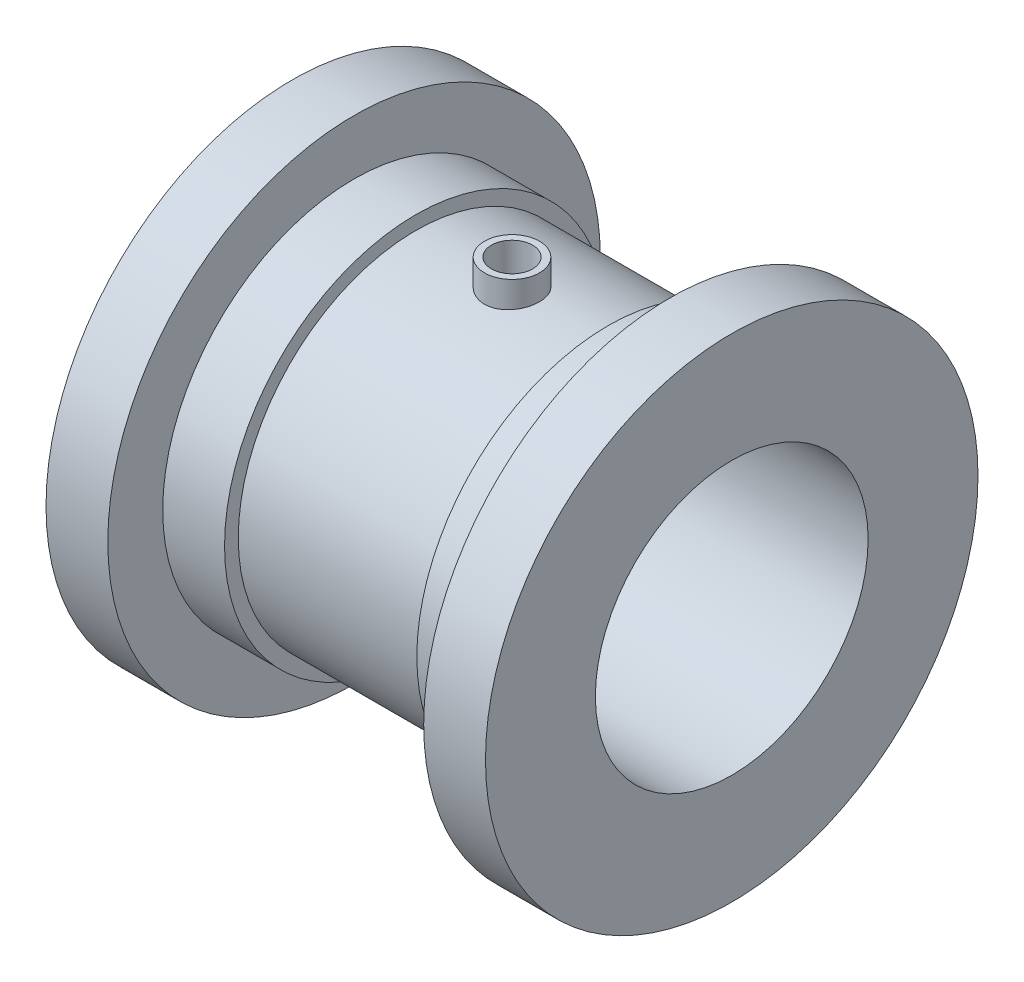
ISO-10303-21;
HEADER;
FILE_DESCRIPTION(('STEP AP214'),'2;1');
FILE_NAME('part.step','',(''),(''),'','','');
FILE_SCHEMA(('AUTOMOTIVE_DESIGN { 1 0 10303 214 1 1 1 1 }'));
ENDSEC;
DATA;
#1=APPLICATION_CONTEXT('core data for automotive mechanical design processes');
#2=APPLICATION_PROTOCOL_DEFINITION('international standard','automotive_design',2000,#1);
#3=PRODUCT_CONTEXT('',#1,'mechanical');
#4=PRODUCT('Part','Part','',(#3));
#5=PRODUCT_RELATED_PRODUCT_CATEGORY('part','',(#4));
#6=PRODUCT_DEFINITION_FORMATION('','',#4);
#7=PRODUCT_DEFINITION_CONTEXT('part definition',#1,'design');
#8=PRODUCT_DEFINITION('design','',#6,#7);
#9=PRODUCT_DEFINITION_SHAPE('','',#8);
#10=(LENGTH_UNIT() NAMED_UNIT(*) SI_UNIT(.MILLI.,.METRE.));
#11=(NAMED_UNIT(*) PLANE_ANGLE_UNIT() SI_UNIT($,.RADIAN.));
#12=(NAMED_UNIT(*) SI_UNIT($,.STERADIAN.) SOLID_ANGLE_UNIT());
#13=UNCERTAINTY_MEASURE_WITH_UNIT(LENGTH_MEASURE(1.E-05),#10,'distance_accuracy_value','');
#14=(GEOMETRIC_REPRESENTATION_CONTEXT(3) GLOBAL_UNCERTAINTY_ASSIGNED_CONTEXT((#13)) GLOBAL_UNIT_ASSIGNED_CONTEXT((#10,
#11,#12)) REPRESENTATION_CONTEXT('',''));
#15=CARTESIAN_POINT('',(0.,0.,0.));
#16=DIRECTION('',(0.,0.,1.));
#17=DIRECTION('',(1.,0.,0.));
#18=AXIS2_PLACEMENT_3D('',#15,#16,#17);
#19=CARTESIAN_POINT('',(-45.635800037677,0.49240465140176,0.));
#20=DIRECTION('',(-1.,0.,0.));
#21=DIRECTION('',(0.,0.,1.));
#22=AXIS2_PLACEMENT_3D('',#19,#20,#21);
#23=CYLINDRICAL_SURFACE('',#22,35.8603209398709);
#24=CARTESIAN_POINT('',(-32.,0.49240465140176,0.));
#25=DIRECTION('',(-1.,0.,0.));
#26=DIRECTION('',(0.,0.,1.));
#27=AXIS2_PLACEMENT_3D('',#24,#25,#26);
#28=CIRCLE('',#27,35.8603209398709);
#29=CARTESIAN_POINT('',(-32.,0.49240465140176,35.8603209398709));
#30=VERTEX_POINT('',#29);
#31=EDGE_CURVE('E93',#30,#30,#28,.T.);
#32=ORIENTED_EDGE('',*,*,#31,.F.);
#33=EDGE_LOOP('',(#32));
#34=FACE_BOUND('',#33,.T.);
#35=CARTESIAN_POINT('',(-23.,0.49240465140176,0.));
#36=DIRECTION('',(-1.,0.,0.));
#37=DIRECTION('',(0.,0.,1.));
#38=AXIS2_PLACEMENT_3D('',#35,#36,#37);
#39=CIRCLE('',#38,35.8603209398709);
#40=CARTESIAN_POINT('',(-23.,0.49240465140176,35.8603209398709));
#41=VERTEX_POINT('',#40);
#42=EDGE_CURVE('E11',#41,#41,#39,.T.);
#43=ORIENTED_EDGE('',*,*,#42,.T.);
#44=EDGE_LOOP('',(#43));
#45=FACE_BOUND('',#44,.T.);
#46=ADVANCED_FACE('F41',(#34,#45),#23,.T.);
#47=CARTESIAN_POINT('',(-23.,36.3527255912726,0.));
#48=DIRECTION('',(-1.,0.,0.));
#49=DIRECTION('',(0.,0.,1.));
#50=AXIS2_PLACEMENT_3D('',#47,#48,#49);
#51=PLANE('',#50);
#52=ORIENTED_EDGE('',*,*,#42,.F.);
#53=EDGE_LOOP('',(#52));
#54=FACE_BOUND('',#53,.T.);
#55=CARTESIAN_POINT('',(-23.,0.49240465140176,0.));
#56=DIRECTION('',(-1.,0.,0.));
#57=DIRECTION('',(0.,0.,1.));
#58=AXIS2_PLACEMENT_3D('',#55,#56,#57);
#59=CIRCLE('',#58,27.8603209398709);
#60=CARTESIAN_POINT('',(-23.,0.49240465140176,27.8603209398709));
#61=VERTEX_POINT('',#60);
#62=EDGE_CURVE('E53',#61,#61,#59,.T.);
#63=ORIENTED_EDGE('',*,*,#62,.T.);
#64=EDGE_LOOP('',(#63));
#65=FACE_BOUND('',#64,.T.);
#66=ADVANCED_FACE('F113',(#54,#65),#51,.F.);
#67=CARTESIAN_POINT('',(-45.635800037677,0.49240465140176,0.));
#68=DIRECTION('',(-1.,0.,0.));
#69=DIRECTION('',(0.,0.,1.));
#70=AXIS2_PLACEMENT_3D('',#67,#68,#69);
#71=CYLINDRICAL_SURFACE('',#70,27.8603209398709);
#72=ORIENTED_EDGE('',*,*,#62,.F.);
#73=EDGE_LOOP('',(#72));
#74=FACE_BOUND('',#73,.T.);
#75=CARTESIAN_POINT('',(-14.,0.49240465140176,0.));
#76=DIRECTION('',(-1.,0.,0.));
#77=DIRECTION('',(0.,0.,1.));
#78=AXIS2_PLACEMENT_3D('',#75,#76,#77);
#79=CIRCLE('',#78,27.8603209398709);
#80=CARTESIAN_POINT('',(-14.,0.49240465140176,27.8603209398709));
#81=VERTEX_POINT('',#80);
#82=EDGE_CURVE('E58',#81,#81,#79,.T.);
#83=ORIENTED_EDGE('',*,*,#82,.T.);
#84=EDGE_LOOP('',(#83));
#85=FACE_BOUND('',#84,.T.);
#86=ADVANCED_FACE('F110',(#74,#85),#71,.T.);
#87=CARTESIAN_POINT('',(-14.,28.3527255912726,0.));
#88=DIRECTION('',(-1.,0.,0.));
#89=DIRECTION('',(0.,0.,1.));
#90=AXIS2_PLACEMENT_3D('',#87,#88,#89);
#91=PLANE('',#90);
#92=ORIENTED_EDGE('',*,*,#82,.F.);
#93=EDGE_LOOP('',(#92));
#94=FACE_BOUND('',#93,.T.);
#95=CARTESIAN_POINT('',(-14.,0.49240465140176,0.));
#96=DIRECTION('',(-1.,0.,0.));
#97=DIRECTION('',(0.,0.,1.));
#98=AXIS2_PLACEMENT_3D('',#95,#96,#97);
#99=CIRCLE('',#98,25.8603209398709);
#100=CARTESIAN_POINT('',(-14.,0.49240465140176,25.8603209398709));
#101=VERTEX_POINT('',#100);
#102=EDGE_CURVE('E126',#101,#101,#99,.T.);
#103=ORIENTED_EDGE('',*,*,#102,.T.);
#104=EDGE_LOOP('',(#103));
#105=FACE_BOUND('',#104,.T.);
#106=ADVANCED_FACE('F105',(#94,#105),#91,.F.);
#107=CARTESIAN_POINT('',(-45.635800037677,0.49240465140176,0.));
#108=DIRECTION('',(-1.,0.,0.));
#109=DIRECTION('',(0.,0.,1.));
#110=AXIS2_PLACEMENT_3D('',#107,#108,#109);
#111=CYLINDRICAL_SURFACE('',#110,25.8603209398709);
#112=CARTESIAN_POINT('',(0.,26.041498551443,4.));
#113=CARTESIAN_POINT('',(0.223235078696461,26.0415023715428,3.99999084326046));
#114=CARTESIAN_POINT('',(0.446597670654171,26.0444559962012,3.98124906814162));
#115=CARTESIAN_POINT('',(0.887071885793124,26.0559426184085,3.90680047870448));
#116=CARTESIAN_POINT('',(1.10417729232606,26.0644809776663,3.85105814067276));
#117=CARTESIAN_POINT('',(1.52569792990848,26.086147385703,3.70432115944753));
#118=CARTESIAN_POINT('',(1.7301229877367,26.09927182677,3.61335422016288));
#119=CARTESIAN_POINT('',(2.12078094974435,26.1286273283384,3.3988165465793));
#120=CARTESIAN_POINT('',(2.30701622995979,26.1448579822693,3.27525007841262));
#121=CARTESIAN_POINT('',(2.65761919887285,26.1787514511707,2.99789888182619));
#122=CARTESIAN_POINT('',(2.821809729735,26.1964242230253,2.84389139411188));
#123=CARTESIAN_POINT('',(3.1221262532405,26.2311218989636,2.51051100304322));
#124=CARTESIAN_POINT('',(3.25825067094325,26.2481467666462,2.33113667717079));
#125=CARTESIAN_POINT('',(3.499227687357,26.2797349060224,1.95097582689146));
#126=CARTESIAN_POINT('',(3.60391666212749,26.2942851325822,1.75008440789343));
#127=CARTESIAN_POINT('',(3.77800057426712,26.3191741482448,1.33330624459607));
#128=CARTESIAN_POINT('',(3.84739749225448,26.329513173677,1.11742034257206));
#129=CARTESIAN_POINT('',(3.9483889869917,26.3447446024268,0.678607613865191));
#130=CARTESIAN_POINT('',(3.98028051717067,26.3496797696504,0.455750638592846));
#131=CARTESIAN_POINT('',(4.00627837606847,26.3536940860209,0.00779768197377162));
#132=CARTESIAN_POINT('',(4.00038693189221,26.3527735803285,-0.217298166622402));
#133=CARTESIAN_POINT('',(3.95121967593788,26.3452143497849,-0.661312053638072));
#134=CARTESIAN_POINT('',(3.90826336749048,26.3386244967729,-0.880266422196354));
#135=CARTESIAN_POINT('',(3.78668770168433,26.3205214579585,-1.30782133729719));
#136=CARTESIAN_POINT('',(3.70806737967128,26.3090081389848,-1.51642160360858));
#137=CARTESIAN_POINT('',(3.5170709356684,26.2822680097395,-1.91830940992599));
#138=CARTESIAN_POINT('',(3.40456108192839,26.2670265333806,-2.1115323786077));
#139=CARTESIAN_POINT('',(3.1490770432953,26.2345273206054,-2.47647670209884));
#140=CARTESIAN_POINT('',(3.00610072818882,26.2172694432405,-2.64819655207772));
#141=CARTESIAN_POINT('',(2.69196454706266,26.1824476480985,-2.96714470703453));
#142=CARTESIAN_POINT('',(2.52052564328325,26.1648824170914,-3.11409817486465));
#143=CARTESIAN_POINT('',(2.15527670808161,26.1316012310287,-3.37719386686125));
#144=CARTESIAN_POINT('',(1.96146652183675,26.1158852887728,-3.49333587777569));
#145=CARTESIAN_POINT('',(1.55668139874425,26.088082161248,-3.6915534907609));
#146=CARTESIAN_POINT('',(1.34569175841384,26.0759981268275,-3.7735995364777));
#147=CARTESIAN_POINT('',(0.912698248703498,26.0568817355788,-3.90101280403022));
#148=CARTESIAN_POINT('',(0.690695208720324,26.0498489989631,-3.94638278342901));
#149=CARTESIAN_POINT('',(0.244425745626258,26.0417039111849,-3.99877638189308));
#150=CARTESIAN_POINT('',(0.0202061941221937,26.0405313206997,-4.00619019050783));
#151=CARTESIAN_POINT('',(-0.426272447683629,26.0440792182801,-3.98349755044328));
#152=CARTESIAN_POINT('',(-0.648531602568696,26.0487995114748,-3.95339234247497));
#153=CARTESIAN_POINT('',(-1.08356323902636,26.06354589513,-3.85684765553785));
#154=CARTESIAN_POINT('',(-1.29638016758638,26.0735434230924,-3.79060370976712));
#155=CARTESIAN_POINT('',(-1.70789039216207,26.0976941405928,-3.623865819776));
#156=CARTESIAN_POINT('',(-1.90658294961586,26.1118475472432,-3.52337008612298));
#157=CARTESIAN_POINT('',(-2.28594999929625,26.1428566831115,-3.29004833782971));
#158=CARTESIAN_POINT('',(-2.46646784780051,26.1597330997277,-3.15697042739943));
#159=CARTESIAN_POINT('',(-2.8027484878409,26.1942248943289,-2.86261088768299));
#160=CARTESIAN_POINT('',(-2.95850978681409,26.2118403167874,-2.7013275591332));
#161=CARTESIAN_POINT('',(-3.24226349312508,26.2460141962602,-2.35341423203775));
#162=CARTESIAN_POINT('',(-3.36999687120947,26.2625618712333,-2.16657175587908));
#163=CARTESIAN_POINT('',(-3.59226155896465,26.2925667918355,-1.77385430633165));
#164=CARTESIAN_POINT('',(-3.68679382324598,26.3060241263154,-1.56797988037149));
#165=CARTESIAN_POINT('',(-3.83956188800598,26.3282849507809,-1.14384063461669));
#166=CARTESIAN_POINT('',(-3.89793766628388,26.3371063680912,-0.925627213381367));
#167=CARTESIAN_POINT('',(-3.97718810792214,26.3491768249089,-0.482347943198597));
#168=CARTESIAN_POINT('',(-3.99806541196336,26.3524262568005,-0.257282577907266));
#169=CARTESIAN_POINT('',(-4.00165869979233,26.3529822517439,0.190802835524679));
#170=CARTESIAN_POINT('',(-3.98477041146674,26.3503504417613,0.413819734263655));
#171=CARTESIAN_POINT('',(-3.91416222111441,26.3395643457862,0.853801370782615));
#172=CARTESIAN_POINT('',(-3.86044245936849,26.3314100808271,1.07076613161023));
#173=CARTESIAN_POINT('',(-3.71783977845517,26.3104912623486,1.49236444435116));
#174=CARTESIAN_POINT('',(-3.6289859629113,26.2977305254034,1.69700804135429));
#175=CARTESIAN_POINT('',(-3.4186800811105,26.2689980238011,2.08854387777262));
#176=CARTESIAN_POINT('',(-3.29722682261554,26.2530261417104,2.27543546761681));
#177=CARTESIAN_POINT('',(-3.02374624371408,26.2194466946816,2.62816569529418));
#178=CARTESIAN_POINT('',(-2.87142735869956,26.2018244651251,2.79377690159537));
#179=CARTESIAN_POINT('',(-2.54115265071612,26.1670370216216,3.09723130092927));
#180=CARTESIAN_POINT('',(-2.36319082480621,26.1498719158039,3.23506797384937));
#181=CARTESIAN_POINT('',(-1.98542188192016,26.1178314947969,3.47980875645661));
#182=CARTESIAN_POINT('',(-1.78549003923046,26.102970543968,3.5865222084603));
#183=CARTESIAN_POINT('',(-1.37040087050697,26.0773897722471,3.76469216256432));
#184=CARTESIAN_POINT('',(-1.15525944746334,26.0666656994874,3.83618488545737));
#185=CARTESIAN_POINT('',(-0.782654569801745,26.0530238493501,3.92584666853802));
#186=CARTESIAN_POINT('',(-0.627480779408552,26.048725076571,3.95361106824486));
#187=CARTESIAN_POINT('',(-0.314892456547065,26.0429611004124,3.99069083212244));
#188=CARTESIAN_POINT('',(-0.157477956077747,26.0414958566089,4.00000645948941));
#189=CARTESIAN_POINT('',(0.,26.041498551443,4.));
#190=B_SPLINE_CURVE_WITH_KNOTS('',3,(#112,#113,#114,#115,#116,#117,#118,#119,#120,#121,#122,
#123,#124,#125,#126,#127,#128,#129,#130,#131,#132,#133,#134,#135,#136,#137,#138,#139,#140,#141,
#142,#143,#144,#145,#146,#147,#148,#149,#150,#151,#152,#153,#154,#155,#156,#157,#158,#159,#160,
#161,#162,#163,#164,#165,#166,#167,#168,#169,#170,#171,#172,#173,#174,#175,#176,#177,#178,#179,
#180,#181,#182,#183,#184,#185,#186,#187,#188,#189),.UNSPECIFIED.,.T.,.F.,(4,2,2,2,2,2,2,2,2,2,2,
2,2,2,2,2,2,2,2,2,2,2,2,2,2,2,2,2,2,2,2,2,2,2,2,2,2,2,4),(0.,0.669129565415921,1.33890248359209,
2.00814969637032,2.67730937162208,3.35156027351045,4.025849000953,4.70358892673837,
5.3812908130228,6.0535899946383,6.72584954816515,7.3923713918024,8.05891126486052,
8.72811662287007,9.39736878704592,10.0736181698907,10.7498722330661,11.4267112956721,
12.1034994640511,12.773316075001,13.4431105364689,14.1093164235985,14.7755571209792,
15.4471209189554,16.1187251899115,16.7962968045155,17.4738489357383,18.1487612921506,
18.8236261186816,19.4914525263168,20.1592763904014,20.8265482113383,21.4938444392954,
22.1677654985275,22.841844577884,23.5199702040694,24.1973969864152,24.6694314903495,
25.141459260036),.UNSPECIFIED.);
#191=CARTESIAN_POINT('',(0.,26.041498551443,4.));
#192=VERTEX_POINT('',#191);
#193=EDGE_CURVE('E66',#192,#192,#190,.T.);
#194=ORIENTED_EDGE('',*,*,#193,.F.);
#195=EDGE_LOOP('',(#194));
#196=FACE_BOUND('',#195,.T.);
#197=CARTESIAN_POINT('',(0.,-25.1933150993299,3.));
#198=CARTESIAN_POINT('',(0.167901892163172,-25.1933173560347,2.99999280642211));
#199=CARTESIAN_POINT('',(0.335911068326354,-25.1949791680281,2.98585694864572));
#200=CARTESIAN_POINT('',(0.667260489203529,-25.2014449657636,2.929685876814));
#201=CARTESIAN_POINT('',(0.830595558283836,-25.2062523039407,2.88762089578641));
#202=CARTESIAN_POINT('',(1.1477509928841,-25.2184574683041,2.77684244584519));
#203=CARTESIAN_POINT('',(1.30157747497407,-25.2258536083568,2.7081463191542));
#204=CARTESIAN_POINT('',(1.59548769603269,-25.2424009730624,2.54609134141144));
#205=CARTESIAN_POINT('',(1.73557392388027,-25.2515518789702,2.45273696825498));
#206=CARTESIAN_POINT('',(1.99873566985179,-25.2706273150589,2.24353095078096));
#207=CARTESIAN_POINT('',(2.1217351256299,-25.28055501506,2.1275839060216));
#208=CARTESIAN_POINT('',(2.34657554090634,-25.3000368410948,1.87668878542464));
#209=CARTESIAN_POINT('',(2.4484154809691,-25.3095909491113,1.74173979462537));
#210=CARTESIAN_POINT('',(2.62831554343576,-25.3272811824825,1.45619740359608));
#211=CARTESIAN_POINT('',(2.70630733323965,-25.3354132051262,1.30556067603095));
#212=CARTESIAN_POINT('',(2.83585973912194,-25.349308284578,0.993218161130457));
#213=CARTESIAN_POINT('',(2.8874212061018,-25.3550714176494,0.831512730332477));
#214=CARTESIAN_POINT('',(2.96242345523757,-25.36355706764,0.502398069839474));
#215=CARTESIAN_POINT('',(2.98599022482494,-25.3662932034155,0.335017908273429));
#216=CARTESIAN_POINT('',(3.00472431931191,-25.3684630101531,-0.00134254090072416));
#217=CARTESIAN_POINT('',(2.99989261504699,-25.3678967940101,-0.170322773611331));
#218=CARTESIAN_POINT('',(2.96206838156144,-25.3635367605275,-0.504230198759423));
#219=CARTESIAN_POINT('',(2.92921133857713,-25.3597584719814,-0.669172969966987));
#220=CARTESIAN_POINT('',(2.83648063354103,-25.3494164049408,-0.991187256821801));
#221=CARTESIAN_POINT('',(2.77660651902458,-25.342852579796,-1.14825864059513));
#222=CARTESIAN_POINT('',(2.63139548026032,-25.3276503530783,-1.45049385490445));
#223=CARTESIAN_POINT('',(2.54599941562206,-25.3190071422495,-1.59562901930468));
#224=CARTESIAN_POINT('',(2.35221154417119,-25.3006142472112,-1.86955919976054));
#225=CARTESIAN_POINT('',(2.24381882875765,-25.2908645192901,-1.99835356986767));
#226=CARTESIAN_POINT('',(2.00635446711445,-25.2712831143704,-2.23674122419171));
#227=CARTESIAN_POINT('',(1.87716482406937,-25.2614512928595,-2.3462169904106));
#228=CARTESIAN_POINT('',(1.60218061085515,-25.2428706956386,-2.5419478333726));
#229=CARTESIAN_POINT('',(1.45638600078395,-25.2341219225312,-2.62820285431415));
#230=CARTESIAN_POINT('',(1.15223126740478,-25.2186978075187,-2.77504764425012));
#231=CARTESIAN_POINT('',(0.993866963078515,-25.2120231591824,-2.83562883060054));
#232=CARTESIAN_POINT('',(0.669118852653958,-25.2015169115406,-2.92930639686701));
#233=CARTESIAN_POINT('',(0.502735378140214,-25.1976851947898,-2.96240391217513));
#234=CARTESIAN_POINT('',(0.167707451140603,-25.1933197443238,-3.00002070951527));
#235=CARTESIAN_POINT('',(-0.000918235956218547,-25.1927669688599,-3.00470499885878));
#236=CARTESIAN_POINT('',(-0.336552010842732,-25.1949716764043,-2.98579696947045));
#237=CARTESIAN_POINT('',(-0.503560128166951,-25.1977290988578,-2.96220516800473));
#238=CARTESIAN_POINT('',(-0.830728745052976,-25.206226159645,-2.88755323941688));
#239=CARTESIAN_POINT('',(-0.990907553100186,-25.2119572002923,-2.83657228816018));
#240=CARTESIAN_POINT('',(-1.30044201187721,-25.2257487924018,-2.70867046317289));
#241=CARTESIAN_POINT('',(-1.44979733250076,-25.2338094148767,-2.63174879867893));
#242=CARTESIAN_POINT('',(-1.73419386077641,-25.2513977548111,-2.45374042705698));
#243=CARTESIAN_POINT('',(-1.8691666553332,-25.260931997735,-2.35254507427021));
#244=CARTESIAN_POINT('',(-2.12027036162512,-25.2803725077155,-2.12901629291433));
#245=CARTESIAN_POINT('',(-2.23640064348234,-25.290278787195,-2.00668215798852));
#246=CARTESIAN_POINT('',(-2.44709837136283,-25.3094053058216,-1.7436295137138));
#247=CARTESIAN_POINT('',(-2.54155769034848,-25.3186219565297,-1.60282409982068));
#248=CARTESIAN_POINT('',(-2.70548556300875,-25.3352776649366,-1.30725100186564));
#249=CARTESIAN_POINT('',(-2.77495455972282,-25.3427167541479,-1.15248356538946));
#250=CARTESIAN_POINT('',(-2.88674946354459,-25.354963134057,-0.833745957081878));
#251=CARTESIAN_POINT('',(-2.92913894025521,-25.3597765845691,-0.669798328222981));
#252=CARTESIAN_POINT('',(-2.98577859440298,-25.3662548125884,-0.33705347734763));
#253=CARTESIAN_POINT('',(-3.00002985612628,-25.3679197114228,-0.168256442453907));
#254=CARTESIAN_POINT('',(-2.99997022366016,-25.3679128745331,0.168337546177355));
#255=CARTESIAN_POINT('',(-2.98582648385154,-25.3662606658021,0.336134554667182));
#256=CARTESIAN_POINT('',(-2.92973101238916,-25.3598439369233,0.666950441070479));
#257=CARTESIAN_POINT('',(-2.88777928245586,-25.355079416968,0.829969319279566));
#258=CARTESIAN_POINT('',(-2.77730887195289,-25.342971304021,1.14658733404234));
#259=CARTESIAN_POINT('',(-2.70879702604639,-25.335628374572,1.3001888821722));
#260=CARTESIAN_POINT('',(-2.54716854869073,-25.3191786127169,1.59374025953111));
#261=CARTESIAN_POINT('',(-2.45405179058331,-25.3100717712307,1.73369001848001));
#262=CARTESIAN_POINT('',(-2.24523455301801,-25.291048098426,1.99682050461617));
#263=CARTESIAN_POINT('',(-2.12940955150134,-25.2811269847753,2.11990210738672));
#264=CARTESIAN_POINT('',(-1.87871900941926,-25.2616280933687,2.34495012297937));
#265=CARTESIAN_POINT('',(-1.74384894513398,-25.2520503978637,2.44691150493972));
#266=CARTESIAN_POINT('',(-1.4583870480112,-25.2342886418276,2.62710909290893));
#267=CARTESIAN_POINT('',(-1.30774419792369,-25.2261093439739,2.70526490111134));
#268=CARTESIAN_POINT('',(-0.995466256487434,-25.2121265241887,2.83506195789389));
#269=CARTESIAN_POINT('',(-0.833843515937225,-25.2063203827582,2.8867324571577));
#270=CARTESIAN_POINT('',(-0.559460722954569,-25.199172153817,2.94952236968428));
#271=CARTESIAN_POINT('',(-0.448441013738313,-25.196986482049,2.96842478734545));
#272=CARTESIAN_POINT('',(-0.224963586994817,-25.1940572031889,2.99366597376463));
#273=CARTESIAN_POINT('',(-0.112505878362073,-25.1933135871816,3.00000482019463));
#274=CARTESIAN_POINT('',(0.,-25.1933150993299,3.));
#275=B_SPLINE_CURVE_WITH_KNOTS('',3,(#197,#198,#199,#200,#201,#202,#203,#204,#205,#206,#207,
#208,#209,#210,#211,#212,#213,#214,#215,#216,#217,#218,#219,#220,#221,#222,#223,#224,#225,#226,
#227,#228,#229,#230,#231,#232,#233,#234,#235,#236,#237,#238,#239,#240,#241,#242,#243,#244,#245,
#246,#247,#248,#249,#250,#251,#252,#253,#254,#255,#256,#257,#258,#259,#260,#261,#262,#263,#264,
#265,#266,#267,#268,#269,#270,#271,#272,#273,#274),.UNSPECIFIED.,.T.,.F.,(4,2,2,2,2,2,2,2,2,2,2,
2,2,2,2,2,2,2,2,2,2,2,2,2,2,2,2,2,2,2,2,2,2,2,2,2,2,2,4),(0.,0.503294734238803,1.007126744962,
1.51063120953789,2.01404430135454,2.51963108051117,3.02524221247894,3.5322887926299,
4.03931904782805,4.54405871145072,5.04878112005027,5.55107722955804,6.05338175151261,
6.55685937746021,7.06035689958585,7.56681893956519,8.07328219660821,8.57991462867372,
9.08652612994491,9.59019269067838,10.0938500377736,10.5960591979707,11.0982836686375,
11.6027994075481,12.107332008216,12.6143297250287,13.1213184531193,13.6271126006668,
14.1328872574154,14.6356932737828,15.1384992590422,15.6411759440037,16.1438552166353,
16.6493722121077,17.1550094842095,17.6623359634811,18.1691009316786,18.5063452919983,
18.8435875673594),.UNSPECIFIED.);
#276=CARTESIAN_POINT('',(0.,-25.1933150993299,3.));
#277=VERTEX_POINT('',#276);
#278=EDGE_CURVE('E85',#277,#277,#275,.T.);
#279=ORIENTED_EDGE('',*,*,#278,.T.);
#280=EDGE_LOOP('',(#279));
#281=FACE_BOUND('',#280,.T.);
#282=ORIENTED_EDGE('',*,*,#102,.F.);
#283=EDGE_LOOP('',(#282));
#284=FACE_BOUND('',#283,.T.);
#285=CARTESIAN_POINT('',(14.,0.49240465140176,0.));
#286=DIRECTION('',(-1.,0.,0.));
#287=DIRECTION('',(0.,0.,1.));
#288=AXIS2_PLACEMENT_3D('',#285,#286,#287);
#289=CIRCLE('',#288,25.8603209398709);
#290=CARTESIAN_POINT('',(14.,0.49240465140176,25.8603209398709));
#291=VERTEX_POINT('',#290);
#292=EDGE_CURVE('E128',#291,#291,#289,.T.);
#293=ORIENTED_EDGE('',*,*,#292,.T.);
#294=EDGE_LOOP('',(#293));
#295=FACE_BOUND('',#294,.T.);
#296=ADVANCED_FACE('F99',(#196,#281,#284,#295),#111,.T.);
#297=CARTESIAN_POINT('',(14.,28.3527255912726,0.));
#298=DIRECTION('',(1.,0.,0.));
#299=DIRECTION('',(0.,0.,-1.));
#300=AXIS2_PLACEMENT_3D('',#297,#298,#299);
#301=PLANE('',#300);
#302=ORIENTED_EDGE('',*,*,#292,.F.);
#303=EDGE_LOOP('',(#302));
#304=FACE_BOUND('',#303,.T.);
#305=CARTESIAN_POINT('',(14.,0.49240465140176,0.));
#306=DIRECTION('',(-1.,0.,0.));
#307=DIRECTION('',(0.,0.,1.));
#308=AXIS2_PLACEMENT_3D('',#305,#306,#307);
#309=CIRCLE('',#308,27.8603209398709);
#310=CARTESIAN_POINT('',(14.,0.49240465140176,27.8603209398709));
#311=VERTEX_POINT('',#310);
#312=EDGE_CURVE('E133',#311,#311,#309,.T.);
#313=ORIENTED_EDGE('',*,*,#312,.T.);
#314=EDGE_LOOP('',(#313));
#315=FACE_BOUND('',#314,.T.);
#316=ADVANCED_FACE('F104',(#304,#315),#301,.F.);
#317=CARTESIAN_POINT('',(-45.635800037677,0.49240465140176,0.));
#318=DIRECTION('',(-1.,0.,0.));
#319=DIRECTION('',(0.,0.,1.));
#320=AXIS2_PLACEMENT_3D('',#317,#318,#319);
#321=CYLINDRICAL_SURFACE('',#320,27.8603209398709);
#322=ORIENTED_EDGE('',*,*,#312,.F.);
#323=EDGE_LOOP('',(#322));
#324=FACE_BOUND('',#323,.T.);
#325=CARTESIAN_POINT('',(23.,0.49240465140176,0.));
#326=DIRECTION('',(-1.,0.,0.));
#327=DIRECTION('',(0.,0.,1.));
#328=AXIS2_PLACEMENT_3D('',#325,#326,#327);
#329=CIRCLE('',#328,27.8603209398709);
#330=CARTESIAN_POINT('',(23.,0.49240465140176,27.8603209398709));
#331=VERTEX_POINT('',#330);
#332=EDGE_CURVE('E136',#331,#331,#329,.T.);
#333=ORIENTED_EDGE('',*,*,#332,.T.);
#334=EDGE_LOOP('',(#333));
#335=FACE_BOUND('',#334,.T.);
#336=ADVANCED_FACE('F199',(#324,#335),#321,.T.);
#337=CARTESIAN_POINT('',(23.,36.3527255912726,0.));
#338=DIRECTION('',(1.,0.,0.));
#339=DIRECTION('',(0.,0.,-1.));
#340=AXIS2_PLACEMENT_3D('',#337,#338,#339);
#341=PLANE('',#340);
#342=ORIENTED_EDGE('',*,*,#332,.F.);
#343=EDGE_LOOP('',(#342));
#344=FACE_BOUND('',#343,.T.);
#345=CARTESIAN_POINT('',(23.,0.49240465140176,0.));
#346=DIRECTION('',(-1.,0.,0.));
#347=DIRECTION('',(0.,0.,1.));
#348=AXIS2_PLACEMENT_3D('',#345,#346,#347);
#349=CIRCLE('',#348,35.8603209398709);
#350=CARTESIAN_POINT('',(23.,0.49240465140176,35.8603209398709));
#351=VERTEX_POINT('',#350);
#352=EDGE_CURVE('E139',#351,#351,#349,.T.);
#353=ORIENTED_EDGE('',*,*,#352,.T.);
#354=EDGE_LOOP('',(#353));
#355=FACE_BOUND('',#354,.T.);
#356=ADVANCED_FACE('F204',(#344,#355),#341,.F.);
#357=CARTESIAN_POINT('',(-45.635800037677,0.49240465140176,0.));
#358=DIRECTION('',(-1.,0.,0.));
#359=DIRECTION('',(0.,0.,1.));
#360=AXIS2_PLACEMENT_3D('',#357,#358,#359);
#361=CYLINDRICAL_SURFACE('',#360,35.8603209398709);
#362=ORIENTED_EDGE('',*,*,#352,.F.);
#363=EDGE_LOOP('',(#362));
#364=FACE_BOUND('',#363,.T.);
#365=CARTESIAN_POINT('',(32.,0.49240465140176,0.));
#366=DIRECTION('',(-1.,0.,0.));
#367=DIRECTION('',(0.,0.,1.));
#368=AXIS2_PLACEMENT_3D('',#365,#366,#367);
#369=CIRCLE('',#368,35.8603209398709);
#370=CARTESIAN_POINT('',(32.,0.49240465140176,35.8603209398709));
#371=VERTEX_POINT('',#370);
#372=EDGE_CURVE('E142',#371,#371,#369,.T.);
#373=ORIENTED_EDGE('',*,*,#372,.T.);
#374=EDGE_LOOP('',(#373));
#375=FACE_BOUND('',#374,.T.);
#376=ADVANCED_FACE('F166',(#364,#375),#361,.T.);
#377=CARTESIAN_POINT('',(32.,20.3527255912726,0.));
#378=DIRECTION('',(-1.,0.,0.));
#379=DIRECTION('',(0.,0.,1.));
#380=AXIS2_PLACEMENT_3D('',#377,#378,#379);
#381=PLANE('',#380);
#382=ORIENTED_EDGE('',*,*,#372,.F.);
#383=EDGE_LOOP('',(#382));
#384=FACE_BOUND('',#383,.T.);
#385=CARTESIAN_POINT('',(32.,0.49240465140176,0.));
#386=DIRECTION('',(-1.,0.,0.));
#387=DIRECTION('',(0.,0.,1.));
#388=AXIS2_PLACEMENT_3D('',#385,#386,#387);
#389=CIRCLE('',#388,19.8603209398709);
#390=CARTESIAN_POINT('',(32.,0.49240465140176,19.8603209398709));
#391=VERTEX_POINT('',#390);
#392=EDGE_CURVE('E145',#391,#391,#389,.T.);
#393=ORIENTED_EDGE('',*,*,#392,.T.);
#394=EDGE_LOOP('',(#393));
#395=FACE_BOUND('',#394,.T.);
#396=ADVANCED_FACE('F161',(#384,#395),#381,.F.);
#397=CARTESIAN_POINT('',(-45.635800037677,0.49240465140176,0.));
#398=DIRECTION('',(-1.,0.,0.));
#399=DIRECTION('',(0.,0.,1.));
#400=AXIS2_PLACEMENT_3D('',#397,#398,#399);
#401=CYLINDRICAL_SURFACE('',#400,19.8603209398709);
#402=CARTESIAN_POINT('',(0.,-19.1400263706259,3.));
#403=CARTESIAN_POINT('',(-0.167476691923353,-19.1400291853249,2.99999309319032));
#404=CARTESIAN_POINT('',(-0.335050254062339,-19.1421925797247,2.98592835110764));
#405=CARTESIAN_POINT('',(-0.66551119479038,-19.1506064256597,2.93005650916623));
#406=CARTESIAN_POINT('',(-0.828393856762568,-19.1568608504796,2.88822243863425));
#407=CARTESIAN_POINT('',(-1.14464187062322,-19.1727325678677,2.77809294686108));
#408=CARTESIAN_POINT('',(-1.29801445999217,-19.1823472652359,2.70981794205123));
#409=CARTESIAN_POINT('',(-1.59110512953038,-19.2038531136369,2.54879290075825));
#410=CARTESIAN_POINT('',(-1.73082506518774,-19.2157439546745,2.45604619650225));
#411=CARTESIAN_POINT('',(-1.99379979835969,-19.240570210167,2.24790651048417));
#412=CARTESIAN_POINT('',(-2.11692770037123,-19.2535125812183,2.13235401177106));
#413=CARTESIAN_POINT('',(-2.34212341262087,-19.27892154441,1.8822273078593));
#414=CARTESIAN_POINT('',(-2.44419005958291,-19.2913881102392,1.74765205266833));
#415=CARTESIAN_POINT('',(-2.6248346441993,-19.3145136479836,1.46248644831975));
#416=CARTESIAN_POINT('',(-2.70329565406853,-19.3251635120242,1.31182122705712));
#417=CARTESIAN_POINT('',(-2.8337513035495,-19.3433786243418,0.999263148200993));
#418=CARTESIAN_POINT('',(-2.88574736091533,-19.3509440378517,0.837370892579051));
#419=CARTESIAN_POINT('',(-2.96141224945942,-19.3620887538008,0.508261358681333));
#420=CARTESIAN_POINT('',(-2.98529361510165,-19.3656979489684,0.341093972410834));
#421=CARTESIAN_POINT('',(-3.0047112079792,-19.3686260358517,0.00508837811468921));
#422=CARTESIAN_POINT('',(-3.0002490321225,-19.3679451692745,-0.163749735245122));
#423=CARTESIAN_POINT('',(-2.96327381200333,-19.3623937192812,-0.496853861793342));
#424=CARTESIAN_POINT('',(-2.93098942669491,-19.3575572896392,-0.661145906625824));
#425=CARTESIAN_POINT('',(-2.83964521295321,-19.3442761918378,-0.981953559571495));
#426=CARTESIAN_POINT('',(-2.78058468748525,-19.3358314297469,-1.13846896512604));
#427=CARTESIAN_POINT('',(-2.63713103164235,-19.316223864173,-1.439971805084));
#428=CARTESIAN_POINT('',(-2.55264176363083,-19.3050507765877,-1.58491280162183));
#429=CARTESIAN_POINT('',(-2.36079916887444,-19.2812315551451,-1.85864614274235));
#430=CARTESIAN_POINT('',(-2.25344431617521,-19.2685853230018,-1.98743740864715));
#431=CARTESIAN_POINT('',(-2.01764449819308,-19.2430810434958,-2.22656343065359));
#432=CARTESIAN_POINT('',(-1.8889998821719,-19.2302221414963,-2.33670131404086));
#433=CARTESIAN_POINT('',(-1.61495026441652,-19.2058647655831,-2.53385649489898));
#434=CARTESIAN_POINT('',(-1.4695451566969,-19.1943663002732,-2.62087364615375));
#435=CARTESIAN_POINT('',(-1.16589546098064,-19.1740318725936,-2.76934460216629));
#436=CARTESIAN_POINT('',(-1.00764072369843,-19.1651980413677,-2.83077796016649));
#437=CARTESIAN_POINT('',(-0.682896316841991,-19.1512306372984,-2.92613827295994));
#438=CARTESIAN_POINT('',(-0.516407237155296,-19.146096799806,-2.96006719508211));
#439=CARTESIAN_POINT('',(-0.181672363138505,-19.1401609015196,-2.99918507476724));
#440=CARTESIAN_POINT('',(-0.0134599141890166,-19.1393167645068,-3.004653207492));
#441=CARTESIAN_POINT('',(0.321479068066938,-19.1419441104538,-2.98743525989054));
#442=CARTESIAN_POINT('',(0.488205647987491,-19.1454154575467,-2.96475006593289));
#443=CARTESIAN_POINT('',(0.814573912064045,-19.1562439718837,-2.89210626752492));
#444=CARTESIAN_POINT('',(0.974247311362496,-19.1635812903119,-2.84228693256582));
#445=CARTESIAN_POINT('',(1.28297726516453,-19.181298627119,-2.71693398510609));
#446=CARTESIAN_POINT('',(1.43203328809833,-19.1916787977086,-2.64139908622216));
#447=CARTESIAN_POINT('',(1.71654825317365,-19.2144112983156,-2.4660891316372));
#448=CARTESIAN_POINT('',(1.85189473515246,-19.2267780758197,-2.36613346733583));
#449=CARTESIAN_POINT('',(2.10399216048787,-19.2520469253971,-2.14507023780187));
#450=CARTESIAN_POINT('',(2.22074203628656,-19.2649490281477,-2.0239614590884));
#451=CARTESIAN_POINT('',(2.43333577761998,-19.2899663814674,-1.7627999092733));
#452=CARTESIAN_POINT('',(2.52899455826039,-19.3020740578139,-1.62259564031683));
#453=CARTESIAN_POINT('',(2.69540077917696,-19.3240204158816,-1.32794555721084));
#454=CARTESIAN_POINT('',(2.76614890877442,-19.3338591603856,-1.17350013728814));
#455=CARTESIAN_POINT('',(2.88043028347941,-19.350125922551,-0.855328056524211));
#456=CARTESIAN_POINT('',(2.92406446371293,-19.3565665763497,-0.691638323014818));
#457=CARTESIAN_POINT('',(2.9832058816139,-19.3653645344724,-0.359150460608144));
#458=CARTESIAN_POINT('',(2.99871500431839,-19.3677221124575,-0.19035267484093));
#459=CARTESIAN_POINT('',(3.00111955384301,-19.3680854732518,0.145765144943413));
#460=CARTESIAN_POINT('',(2.98829807935407,-19.366134312045,0.313083175981502));
#461=CARTESIAN_POINT('',(2.93501253036889,-19.3581863166805,0.643154985122113));
#462=CARTESIAN_POINT('',(2.89454854800903,-19.3521894960076,0.805908778436002));
#463=CARTESIAN_POINT('',(2.78722754352428,-19.3368209172401,1.12215254252733));
#464=CARTESIAN_POINT('',(2.72039039553698,-19.3274517009615,1.27564938891916));
#465=CARTESIAN_POINT('',(2.56225060122591,-19.3063670296692,1.56929421325394));
#466=CARTESIAN_POINT('',(2.47094713809852,-19.2946514963272,1.70944174532063));
#467=CARTESIAN_POINT('',(2.2654440512377,-19.2700372058308,1.97384496700201));
#468=CARTESIAN_POINT('',(2.15103550674493,-19.2571282813869,2.09793734492807));
#469=CARTESIAN_POINT('',(1.90300941883565,-19.231657028096,2.32526508562243));
#470=CARTESIAN_POINT('',(1.76938737431555,-19.2190947812887,2.42849554744707));
#471=CARTESIAN_POINT('',(1.48583051580047,-19.1956623402179,2.61169864514246));
#472=CARTESIAN_POINT('',(1.33580699808301,-19.1848022065347,2.69153525448434));
#473=CARTESIAN_POINT('',(1.02438602255823,-19.1661216381686,2.82475779411751));
#474=CARTESIAN_POINT('',(0.863000540678286,-19.1582980578786,2.87817111249412));
#475=CARTESIAN_POINT('',(0.584080029973096,-19.1483795587012,2.94494029690711));
#476=CARTESIAN_POINT('',(0.468265723985449,-19.1452637703135,2.96555600098092));
#477=CARTESIAN_POINT('',(0.234983495703195,-19.1410862023663,2.99308818499121));
#478=CARTESIAN_POINT('',(0.117515595333787,-19.1400243955986,3.0000048463929));
#479=CARTESIAN_POINT('',(0.,-19.1400263706259,3.));
#480=B_SPLINE_CURVE_WITH_KNOTS('',3,(#402,#403,#404,#405,#406,#407,#408,#409,#410,#411,#412,
#413,#414,#415,#416,#417,#418,#419,#420,#421,#422,#423,#424,#425,#426,#427,#428,#429,#430,#431,
#432,#433,#434,#435,#436,#437,#438,#439,#440,#441,#442,#443,#444,#445,#446,#447,#448,#449,#450,
#451,#452,#453,#454,#455,#456,#457,#458,#459,#460,#461,#462,#463,#464,#465,#466,#467,#468,#469,
#470,#471,#472,#473,#474,#475,#476,#477,#478,#479),.UNSPECIFIED.,.T.,.F.,(4,2,2,2,2,2,2,2,2,2,2,
2,2,2,2,2,2,2,2,2,2,2,2,2,2,2,2,2,2,2,2,2,2,2,2,2,2,2,4),(0.,0.502000530676918,1.00448933896039,
1.50659092041961,2.00862416768526,2.5143020215301,3.02000779800257,3.5281787796246,
4.03632253515057,4.54059976930473,5.04484859214721,5.54499230560521,6.04514903951832,
6.54722097393719,7.04932642506046,7.55643928474562,8.06355535134854,8.57107593466807,
9.07856021300559,9.58105700869622,10.0835379843712,10.5834638877165,11.0834148027962,
11.5871815043028,12.0909771146571,12.5990318429676,13.1070725114099,13.613210422326,
14.1193144089034,14.6203839507213,15.1214518224118,15.6221428211859,16.1228505375234,
16.6283066340816,17.1338813362139,17.6423399445109,18.1502704187756,18.5025204662977,
18.8547658476871),.UNSPECIFIED.);
#481=CARTESIAN_POINT('',(0.,-19.1400263706259,3.));
#482=VERTEX_POINT('',#481);
#483=EDGE_CURVE('E44',#482,#482,#480,.T.);
#484=ORIENTED_EDGE('',*,*,#483,.T.);
#485=EDGE_LOOP('',(#484));
#486=FACE_BOUND('',#485,.T.);
#487=CARTESIAN_POINT('',(0.,20.1248356734294,3.));
#488=CARTESIAN_POINT('',(0.167476691923352,20.1248384881284,2.99999309319032));
#489=CARTESIAN_POINT('',(0.335050254062339,20.1270018825282,2.98592835110764));
#490=CARTESIAN_POINT('',(0.665511194790379,20.1354157284632,2.93005650916623));
#491=CARTESIAN_POINT('',(0.828393856762568,20.1416701532831,2.88822243863425));
#492=CARTESIAN_POINT('',(1.14464187062322,20.1575418706712,2.77809294686108));
#493=CARTESIAN_POINT('',(1.29801445999217,20.1671565680394,2.70981794205123));
#494=CARTESIAN_POINT('',(1.59110512953038,20.1886624164404,2.54879290075825));
#495=CARTESIAN_POINT('',(1.73082506518774,20.200553257478,2.45604619650225));
#496=CARTESIAN_POINT('',(1.99379979835969,20.2253795129705,2.24790651048417));
#497=CARTESIAN_POINT('',(2.11692770037123,20.2383218840218,2.13235401177106));
#498=CARTESIAN_POINT('',(2.34212341262087,20.2637308472135,1.8822273078593));
#499=CARTESIAN_POINT('',(2.44419005958291,20.2761974130427,1.74765205266833));
#500=CARTESIAN_POINT('',(2.6248346441993,20.2993229507871,1.46248644831975));
#501=CARTESIAN_POINT('',(2.70329565406853,20.3099728148277,1.31182122705713));
#502=CARTESIAN_POINT('',(2.8337513035495,20.3281879271454,0.999263148200994));
#503=CARTESIAN_POINT('',(2.88574736091533,20.3357533406552,0.837370892579052));
#504=CARTESIAN_POINT('',(2.96141224945942,20.3468980566043,0.508261358681334));
#505=CARTESIAN_POINT('',(2.98529361510165,20.3505072517719,0.341093972410834));
#506=CARTESIAN_POINT('',(3.0047112079792,20.3534353386553,0.00508837811468983));
#507=CARTESIAN_POINT('',(3.0002490321225,20.352754472078,-0.163749735245122));
#508=CARTESIAN_POINT('',(2.96327381200333,20.3472030220847,-0.496853861793342));
#509=CARTESIAN_POINT('',(2.93098942669491,20.3423665924427,-0.661145906625823));
#510=CARTESIAN_POINT('',(2.83964521295321,20.3290854946413,-0.981953559571495));
#511=CARTESIAN_POINT('',(2.78058468748525,20.3206407325504,-1.13846896512604));
#512=CARTESIAN_POINT('',(2.63713103164235,20.3010331669765,-1.439971805084));
#513=CARTESIAN_POINT('',(2.55264176363083,20.2898600793912,-1.58491280162183));
#514=CARTESIAN_POINT('',(2.36079916887444,20.2660408579486,-1.85864614274235));
#515=CARTESIAN_POINT('',(2.2534443161752,20.2533946258053,-1.98743740864716));
#516=CARTESIAN_POINT('',(2.01764449819308,20.2278903462994,-2.22656343065359));
#517=CARTESIAN_POINT('',(1.8889998821719,20.2150314442998,-2.33670131404086));
#518=CARTESIAN_POINT('',(1.61495026441652,20.1906740683867,-2.53385649489898));
#519=CARTESIAN_POINT('',(1.46954515669689,20.1791756030767,-2.62087364615375));
#520=CARTESIAN_POINT('',(1.16589546098064,20.1588411753971,-2.76934460216629));
#521=CARTESIAN_POINT('',(1.00764072369843,20.1500073441712,-2.83077796016649));
#522=CARTESIAN_POINT('',(0.68289631684199,20.136039940102,-2.92613827295994));
#523=CARTESIAN_POINT('',(0.516407237155295,20.1309061026095,-2.96006719508211));
#524=CARTESIAN_POINT('',(0.181672363138505,20.1249702043231,-2.99918507476724));
#525=CARTESIAN_POINT('',(0.0134599141890172,20.1241260673103,-3.004653207492));
#526=CARTESIAN_POINT('',(-0.321479068066937,20.1267534132574,-2.98743525989054));
#527=CARTESIAN_POINT('',(-0.48820564798749,20.1302247603503,-2.96475006593289));
#528=CARTESIAN_POINT('',(-0.814573912064045,20.1410532746873,-2.89210626752492));
#529=CARTESIAN_POINT('',(-0.974247311362496,20.1483905931154,-2.84228693256582));
#530=CARTESIAN_POINT('',(-1.28297726516453,20.1661079299225,-2.71693398510609));
#531=CARTESIAN_POINT('',(-1.43203328809832,20.1764881005121,-2.64139908622216));
#532=CARTESIAN_POINT('',(-1.71654825317365,20.1992206011191,-2.4660891316372));
#533=CARTESIAN_POINT('',(-1.85189473515246,20.2115873786233,-2.36613346733583));
#534=CARTESIAN_POINT('',(-2.10399216048786,20.2368562282006,-2.14507023780187));
#535=CARTESIAN_POINT('',(-2.22074203628656,20.2497583309512,-2.0239614590884));
#536=CARTESIAN_POINT('',(-2.43333577761998,20.2747756842709,-1.7627999092733));
#537=CARTESIAN_POINT('',(-2.52899455826039,20.2868833606174,-1.62259564031684));
#538=CARTESIAN_POINT('',(-2.69540077917696,20.3088297186851,-1.32794555721084));
#539=CARTESIAN_POINT('',(-2.76614890877442,20.3186684631891,-1.17350013728814));
#540=CARTESIAN_POINT('',(-2.88043028347941,20.3349352253545,-0.855328056524214));
#541=CARTESIAN_POINT('',(-2.92406446371293,20.3413758791532,-0.691638323014821));
#542=CARTESIAN_POINT('',(-2.9832058816139,20.3501738372759,-0.359150460608147));
#543=CARTESIAN_POINT('',(-2.99871500431839,20.352531415261,-0.190352674840932));
#544=CARTESIAN_POINT('',(-3.00111955384301,20.3528947760553,0.145765144943411));
#545=CARTESIAN_POINT('',(-2.98829807935407,20.3509436148485,0.3130831759815));
#546=CARTESIAN_POINT('',(-2.93501253036889,20.3429956194841,0.643154985122111));
#547=CARTESIAN_POINT('',(-2.89454854800903,20.3369987988111,0.805908778436001));
#548=CARTESIAN_POINT('',(-2.78722754352428,20.3216302200436,1.12215254252733));
#549=CARTESIAN_POINT('',(-2.72039039553698,20.3122610037651,1.27564938891915));
#550=CARTESIAN_POINT('',(-2.56225060122591,20.2911763324727,1.56929421325394));
#551=CARTESIAN_POINT('',(-2.47094713809852,20.2794607991307,1.70944174532063));
#552=CARTESIAN_POINT('',(-2.2654440512377,20.2548465086344,1.97384496700201));
#553=CARTESIAN_POINT('',(-2.15103550674492,20.2419375841904,2.09793734492807));
#554=CARTESIAN_POINT('',(-1.90300941883565,20.2164663308995,2.32526508562243));
#555=CARTESIAN_POINT('',(-1.76938737431555,20.2039040840922,2.42849554744707));
#556=CARTESIAN_POINT('',(-1.48583051580047,20.1804716430214,2.61169864514246));
#557=CARTESIAN_POINT('',(-1.33580699808301,20.1696115093383,2.69153525448434));
#558=CARTESIAN_POINT('',(-1.02438602255823,20.1509309409721,2.82475779411751));
#559=CARTESIAN_POINT('',(-0.863000540678286,20.1431073606821,2.87817111249412));
#560=CARTESIAN_POINT('',(-0.584080029973096,20.1331888615047,2.94494029690711));
#561=CARTESIAN_POINT('',(-0.468265723985449,20.130073073117,2.96555600098092));
#562=CARTESIAN_POINT('',(-0.234983495703195,20.1258955051698,2.99308818499121));
#563=CARTESIAN_POINT('',(-0.117515595333786,20.1248336984022,3.0000048463929));
#564=CARTESIAN_POINT('',(0.,20.1248356734294,3.));
#565=B_SPLINE_CURVE_WITH_KNOTS('',3,(#487,#488,#489,#490,#491,#492,#493,#494,#495,#496,#497,
#498,#499,#500,#501,#502,#503,#504,#505,#506,#507,#508,#509,#510,#511,#512,#513,#514,#515,#516,
#517,#518,#519,#520,#521,#522,#523,#524,#525,#526,#527,#528,#529,#530,#531,#532,#533,#534,#535,
#536,#537,#538,#539,#540,#541,#542,#543,#544,#545,#546,#547,#548,#549,#550,#551,#552,#553,#554,
#555,#556,#557,#558,#559,#560,#561,#562,#563,#564),.UNSPECIFIED.,.T.,.F.,(4,2,2,2,2,2,2,2,2,2,2,
2,2,2,2,2,2,2,2,2,2,2,2,2,2,2,2,2,2,2,2,2,2,2,2,2,2,2,4),(0.,0.502000530676918,1.00448933896039,
1.50659092041961,2.00862416768526,2.5143020215301,3.02000779800257,3.5281787796246,
4.03632253515057,4.54059976930473,5.04484859214721,5.54499230560522,6.04514903951832,
6.5472209739372,7.04932642506047,7.55643928474563,8.06355535134854,8.57107593466808,
9.07856021300559,9.58105700869622,10.0835379843712,10.5834638877165,11.0834148027962,
11.5871815043028,12.0909771146571,12.5990318429676,13.1070725114099,13.613210422326,
14.1193144089034,14.6203839507213,15.1214518224118,15.6221428211858,16.1228505375234,
16.6283066340816,17.1338813362139,17.6423399445109,18.1502704187756,18.5025204662977,
18.8547658476871),.UNSPECIFIED.);
#566=CARTESIAN_POINT('',(0.,20.1248356734294,3.));
#567=VERTEX_POINT('',#566);
#568=EDGE_CURVE('E61',#567,#567,#565,.T.);
#569=ORIENTED_EDGE('',*,*,#568,.T.);
#570=EDGE_LOOP('',(#569));
#571=FACE_BOUND('',#570,.T.);
#572=ORIENTED_EDGE('',*,*,#392,.F.);
#573=EDGE_LOOP('',(#572));
#574=FACE_BOUND('',#573,.T.);
#575=CARTESIAN_POINT('',(-32.,0.49240465140176,0.));
#576=DIRECTION('',(-1.,0.,0.));
#577=DIRECTION('',(0.,0.,1.));
#578=AXIS2_PLACEMENT_3D('',#575,#576,#577);
#579=CIRCLE('',#578,19.8603209398709);
#580=CARTESIAN_POINT('',(-32.,0.49240465140176,19.8603209398709));
#581=VERTEX_POINT('',#580);
#582=EDGE_CURVE('E147',#581,#581,#579,.T.);
#583=ORIENTED_EDGE('',*,*,#582,.T.);
#584=EDGE_LOOP('',(#583));
#585=FACE_BOUND('',#584,.T.);
#586=ADVANCED_FACE('F67',(#486,#571,#574,#585),#401,.F.);
#587=CARTESIAN_POINT('',(-32.,20.3527255912726,0.));
#588=DIRECTION('',(1.,0.,0.));
#589=DIRECTION('',(0.,0.,-1.));
#590=AXIS2_PLACEMENT_3D('',#587,#588,#589);
#591=PLANE('',#590);
#592=ORIENTED_EDGE('',*,*,#582,.F.);
#593=EDGE_LOOP('',(#592));
#594=FACE_BOUND('',#593,.T.);
#595=ORIENTED_EDGE('',*,*,#31,.T.);
#596=EDGE_LOOP('',(#595));
#597=FACE_BOUND('',#596,.T.);
#598=ADVANCED_FACE('F81',(#594,#597),#591,.F.);
#599=CARTESIAN_POINT('',(0.,-35.3679162884691,0.));
#600=DIRECTION('',(0.,1.,0.));
#601=DIRECTION('',(0.,0.,1.));
#602=AXIS2_PLACEMENT_3D('',#599,#600,#601);
#603=CYLINDRICAL_SURFACE('',#602,3.);
#604=ORIENTED_EDGE('',*,*,#568,.F.);
#605=EDGE_LOOP('',(#604));
#606=FACE_BOUND('',#605,.T.);
#607=CARTESIAN_POINT('',(0.,30.,0.));
#608=DIRECTION('',(0.,1.,0.));
#609=DIRECTION('',(0.,0.,1.));
#610=AXIS2_PLACEMENT_3D('',#607,#608,#609);
#611=CIRCLE('',#610,3.);
#612=CARTESIAN_POINT('',(0.,30.,3.));
#613=VERTEX_POINT('',#612);
#614=EDGE_CURVE('E178',#613,#613,#611,.T.);
#615=ORIENTED_EDGE('',*,*,#614,.T.);
#616=EDGE_LOOP('',(#615));
#617=FACE_BOUND('',#616,.T.);
#618=ADVANCED_FACE('F76',(#606,#617),#603,.F.);
#619=ORIENTED_EDGE('',*,*,#483,.F.);
#620=EDGE_LOOP('',(#619));
#621=FACE_BOUND('',#620,.T.);
#622=ORIENTED_EDGE('',*,*,#278,.F.);
#623=EDGE_LOOP('',(#622));
#624=FACE_BOUND('',#623,.T.);
#625=ADVANCED_FACE('F71',(#621,#624),#603,.F.);
#626=CARTESIAN_POINT('',(0.,30.,0.));
#627=DIRECTION('',(0.,1.,0.));
#628=DIRECTION('',(0.,0.,1.));
#629=AXIS2_PLACEMENT_3D('',#626,#627,#628);
#630=PLANE('',#629);
#631=ORIENTED_EDGE('',*,*,#614,.F.);
#632=EDGE_LOOP('',(#631));
#633=FACE_BOUND('',#632,.T.);
#634=CARTESIAN_POINT('',(0.,30.,0.));
#635=DIRECTION('',(0.,1.,0.));
#636=DIRECTION('',(0.,0.,1.));
#637=AXIS2_PLACEMENT_3D('',#634,#635,#636);
#638=CIRCLE('',#637,4.);
#639=CARTESIAN_POINT('',(0.,30.,4.));
#640=VERTEX_POINT('',#639);
#641=EDGE_CURVE('E180',#640,#640,#638,.T.);
#642=ORIENTED_EDGE('',*,*,#641,.T.);
#643=EDGE_LOOP('',(#642));
#644=FACE_BOUND('',#643,.T.);
#645=ADVANCED_FACE('F75',(#633,#644),#630,.T.);
#646=CARTESIAN_POINT('',(0.,-35.3699162884691,0.));
#647=DIRECTION('',(0.,1.,0.));
#648=DIRECTION('',(0.,0.,1.));
#649=AXIS2_PLACEMENT_3D('',#646,#647,#648);
#650=CYLINDRICAL_SURFACE('',#649,4.);
#651=ORIENTED_EDGE('',*,*,#641,.F.);
#652=EDGE_LOOP('',(#651));
#653=FACE_BOUND('',#652,.T.);
#654=ORIENTED_EDGE('',*,*,#193,.T.);
#655=EDGE_LOOP('',(#654));
#656=FACE_BOUND('',#655,.T.);
#657=ADVANCED_FACE('F78',(#653,#656),#650,.T.);
#658=CLOSED_SHELL('',(#46,#66,#86,#106,#296,#316,#336,#356,#376,#396,#586,#598,#618,#625,#645,#657));
#659=MANIFOLD_SOLID_BREP('B2',#658);
#660=ADVANCED_BREP_SHAPE_REPRESENTATION('',(#18,#659),#14);
#661=SHAPE_DEFINITION_REPRESENTATION(#9,#660);
ENDSEC;
END-ISO-10303-21;
